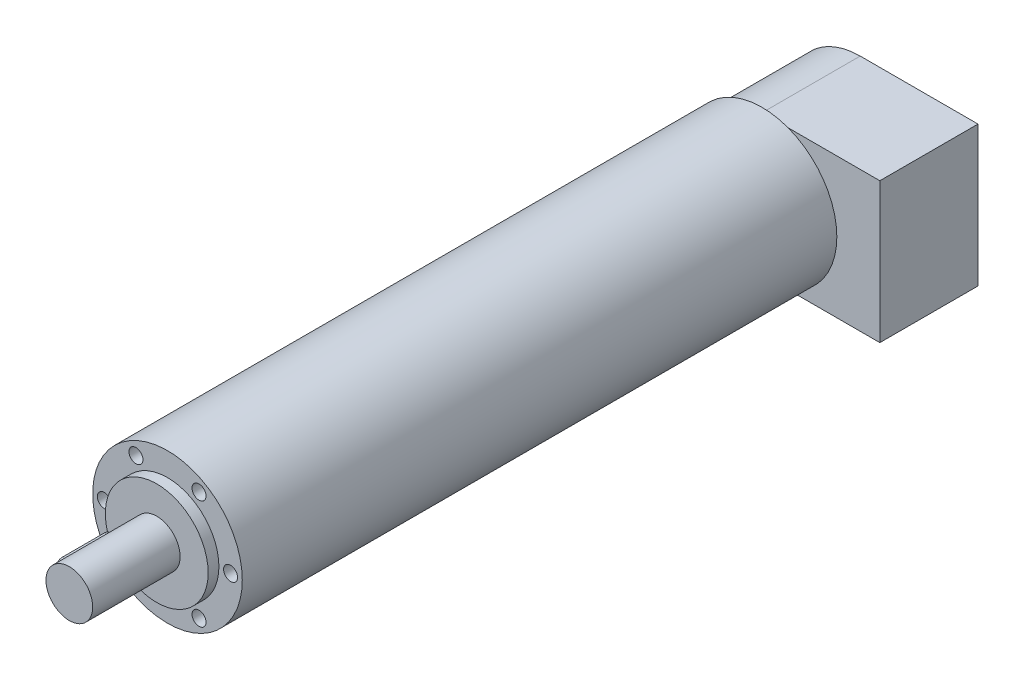
ISO-10303-21;
HEADER;
FILE_DESCRIPTION(('STEP AP214'),'2;1');
FILE_NAME('part.step','',(''),(''),'','','');
FILE_SCHEMA(('AUTOMOTIVE_DESIGN { 1 0 10303 214 1 1 1 1 }'));
ENDSEC;
DATA;
#1=APPLICATION_CONTEXT('core data for automotive mechanical design processes');
#2=APPLICATION_PROTOCOL_DEFINITION('international standard','automotive_design',2000,#1);
#3=PRODUCT_CONTEXT('',#1,'mechanical');
#4=PRODUCT('Part','Part','',(#3));
#5=PRODUCT_RELATED_PRODUCT_CATEGORY('part','',(#4));
#6=PRODUCT_DEFINITION_FORMATION('','',#4);
#7=PRODUCT_DEFINITION_CONTEXT('part definition',#1,'design');
#8=PRODUCT_DEFINITION('design','',#6,#7);
#9=PRODUCT_DEFINITION_SHAPE('','',#8);
#10=(LENGTH_UNIT() NAMED_UNIT(*) SI_UNIT(.MILLI.,.METRE.));
#11=(NAMED_UNIT(*) PLANE_ANGLE_UNIT() SI_UNIT($,.RADIAN.));
#12=(NAMED_UNIT(*) SI_UNIT($,.STERADIAN.) SOLID_ANGLE_UNIT());
#13=UNCERTAINTY_MEASURE_WITH_UNIT(LENGTH_MEASURE(1.E-05),#10,'distance_accuracy_value','');
#14=(GEOMETRIC_REPRESENTATION_CONTEXT(3) GLOBAL_UNCERTAINTY_ASSIGNED_CONTEXT((#13)) GLOBAL_UNIT_ASSIGNED_CONTEXT((#10,
#11,#12)) REPRESENTATION_CONTEXT('',''));
#15=CARTESIAN_POINT('',(0.,0.,0.));
#16=DIRECTION('',(0.,0.,1.));
#17=DIRECTION('',(1.,0.,0.));
#18=AXIS2_PLACEMENT_3D('',#15,#16,#17);
#19=CARTESIAN_POINT('',(0.,0.,21.));
#20=DIRECTION('',(0.,0.,-1.));
#21=DIRECTION('',(-1.,0.,0.));
#22=AXIS2_PLACEMENT_3D('',#19,#20,#21);
#23=CYLINDRICAL_SURFACE('',#22,15.);
#24=CARTESIAN_POINT('',(0.,0.,21.));
#25=DIRECTION('',(0.,0.,1.));
#26=DIRECTION('',(1.,0.,0.));
#27=AXIS2_PLACEMENT_3D('',#24,#25,#26);
#28=CIRCLE('',#27,15.);
#29=CARTESIAN_POINT('',(0.,15.,21.));
#30=VERTEX_POINT('',#29);
#31=CARTESIAN_POINT('',(0.,-15.,21.));
#32=VERTEX_POINT('',#31);
#33=EDGE_CURVE('E188',#30,#32,#28,.T.);
#34=ORIENTED_EDGE('',*,*,#33,.F.);
#35=DIRECTION('',(0.,0.,1.));
#36=VECTOR('',#35,1.);
#37=CARTESIAN_POINT('',(0.,15.,21.));
#38=LINE('',#37,#36);
#39=CARTESIAN_POINT('',(0.,15.,0.));
#40=VERTEX_POINT('',#39);
#41=EDGE_CURVE('E161',#40,#30,#38,.T.);
#42=ORIENTED_EDGE('',*,*,#41,.F.);
#43=CARTESIAN_POINT('',(0.,0.,0.));
#44=DIRECTION('',(0.,0.,1.));
#45=DIRECTION('',(1.,0.,0.));
#46=AXIS2_PLACEMENT_3D('',#43,#44,#45);
#47=CIRCLE('',#46,15.);
#48=CARTESIAN_POINT('',(0.,-15.,0.));
#49=VERTEX_POINT('',#48);
#50=EDGE_CURVE('E187',#40,#49,#47,.T.);
#51=ORIENTED_EDGE('',*,*,#50,.T.);
#52=DIRECTION('',(0.,0.,-1.));
#53=VECTOR('',#52,1.);
#54=CARTESIAN_POINT('',(0.,-15.,21.));
#55=LINE('',#54,#53);
#56=EDGE_CURVE('E168',#32,#49,#55,.T.);
#57=ORIENTED_EDGE('',*,*,#56,.F.);
#58=EDGE_LOOP('',(#34,#42,#51,#57));
#59=FACE_BOUND('',#58,.T.);
#60=ADVANCED_FACE('F34',(#59),#23,.T.);
#61=CARTESIAN_POINT('',(0.,0.,21.));
#62=DIRECTION('',(0.,0.,1.));
#63=DIRECTION('',(1.,0.,0.));
#64=AXIS2_PLACEMENT_3D('',#61,#62,#63);
#65=PLANE('',#64);
#66=CARTESIAN_POINT('',(0.,0.,21.));
#67=DIRECTION('',(0.,0.,1.));
#68=DIRECTION('',(1.,0.,0.));
#69=AXIS2_PLACEMENT_3D('',#66,#67,#68);
#70=CIRCLE('',#69,16.);
#71=CARTESIAN_POINT('',(5.56776436283001,-15.,21.));
#72=VERTEX_POINT('',#71);
#73=CARTESIAN_POINT('',(5.56776436283003,15.,21.));
#74=VERTEX_POINT('',#73);
#75=EDGE_CURVE('E61',#72,#74,#70,.T.);
#76=ORIENTED_EDGE('',*,*,#75,.F.);
#77=DIRECTION('',(-1.,0.,0.));
#78=VECTOR('',#77,1.);
#79=CARTESIAN_POINT('',(25.2,-15.,21.));
#80=LINE('',#79,#78);
#81=CARTESIAN_POINT('',(25.2,-15.,21.));
#82=VERTEX_POINT('',#81);
#83=EDGE_CURVE('E180',#82,#72,#80,.T.);
#84=ORIENTED_EDGE('',*,*,#83,.F.);
#85=DIRECTION('',(0.,-1.,0.));
#86=VECTOR('',#85,1.);
#87=CARTESIAN_POINT('',(25.2,-15.,21.));
#88=LINE('',#87,#86);
#89=CARTESIAN_POINT('',(25.2,15.,21.));
#90=VERTEX_POINT('',#89);
#91=EDGE_CURVE('E170',#90,#82,#88,.T.);
#92=ORIENTED_EDGE('',*,*,#91,.F.);
#93=DIRECTION('',(-1.,0.,0.));
#94=VECTOR('',#93,1.);
#95=CARTESIAN_POINT('',(25.2,15.,21.));
#96=LINE('',#95,#94);
#97=EDGE_CURVE('E183',#90,#74,#96,.T.);
#98=ORIENTED_EDGE('',*,*,#97,.T.);
#99=EDGE_LOOP('',(#76,#84,#92,#98));
#100=FACE_BOUND('',#99,.T.);
#101=ADVANCED_FACE('F223',(#100),#65,.T.);
#102=CARTESIAN_POINT('',(0.,0.,0.));
#103=DIRECTION('',(0.,0.,1.));
#104=DIRECTION('',(1.,0.,0.));
#105=AXIS2_PLACEMENT_3D('',#102,#103,#104);
#106=PLANE('',#105);
#107=ORIENTED_EDGE('',*,*,#50,.F.);
#108=DIRECTION('',(-1.,0.,0.));
#109=VECTOR('',#108,1.);
#110=CARTESIAN_POINT('',(25.2,15.,0.));
#111=LINE('',#110,#109);
#112=CARTESIAN_POINT('',(25.2,15.,0.));
#113=VERTEX_POINT('',#112);
#114=EDGE_CURVE('E185',#113,#40,#111,.T.);
#115=ORIENTED_EDGE('',*,*,#114,.F.);
#116=DIRECTION('',(0.,1.,0.));
#117=VECTOR('',#116,1.);
#118=CARTESIAN_POINT('',(25.2,-15.,0.));
#119=LINE('',#118,#117);
#120=CARTESIAN_POINT('',(25.2,-15.,0.));
#121=VERTEX_POINT('',#120);
#122=EDGE_CURVE('E164',#121,#113,#119,.T.);
#123=ORIENTED_EDGE('',*,*,#122,.F.);
#124=DIRECTION('',(-1.,0.,0.));
#125=VECTOR('',#124,1.);
#126=CARTESIAN_POINT('',(25.2,-15.,0.));
#127=LINE('',#126,#125);
#128=EDGE_CURVE('E174',#121,#49,#127,.T.);
#129=ORIENTED_EDGE('',*,*,#128,.T.);
#130=EDGE_LOOP('',(#107,#115,#123,#129));
#131=FACE_BOUND('',#130,.T.);
#132=ADVANCED_FACE('F228',(#131),#106,.F.);
#133=CARTESIAN_POINT('',(25.2,15.,21.));
#134=DIRECTION('',(0.,-1.,0.));
#135=DIRECTION('',(0.,0.,-1.));
#136=AXIS2_PLACEMENT_3D('',#133,#134,#135);
#137=PLANE('',#136);
#138=ORIENTED_EDGE('',*,*,#41,.T.);
#139=EDGE_CURVE('E182',#74,#30,#96,.T.);
#140=ORIENTED_EDGE('',*,*,#139,.F.);
#141=ORIENTED_EDGE('',*,*,#97,.F.);
#142=DIRECTION('',(0.,0.,1.));
#143=VECTOR('',#142,1.);
#144=CARTESIAN_POINT('',(25.2,15.,21.));
#145=LINE('',#144,#143);
#146=EDGE_CURVE('E167',#113,#90,#145,.T.);
#147=ORIENTED_EDGE('',*,*,#146,.F.);
#148=ORIENTED_EDGE('',*,*,#114,.T.);
#149=EDGE_LOOP('',(#138,#140,#141,#147,#148));
#150=FACE_BOUND('',#149,.T.);
#151=ADVANCED_FACE('F242',(#150),#137,.F.);
#152=CARTESIAN_POINT('',(25.2,-15.,21.));
#153=DIRECTION('',(0.,1.,0.));
#154=DIRECTION('',(0.,0.,1.));
#155=AXIS2_PLACEMENT_3D('',#152,#153,#154);
#156=PLANE('',#155);
#157=ORIENTED_EDGE('',*,*,#56,.T.);
#158=ORIENTED_EDGE('',*,*,#128,.F.);
#159=DIRECTION('',(0.,0.,-1.));
#160=VECTOR('',#159,1.);
#161=CARTESIAN_POINT('',(25.2,-15.,21.));
#162=LINE('',#161,#160);
#163=EDGE_CURVE('E172',#82,#121,#162,.T.);
#164=ORIENTED_EDGE('',*,*,#163,.F.);
#165=ORIENTED_EDGE('',*,*,#83,.T.);
#166=EDGE_CURVE('E179',#72,#32,#80,.T.);
#167=ORIENTED_EDGE('',*,*,#166,.T.);
#168=EDGE_LOOP('',(#157,#158,#164,#165,#167));
#169=FACE_BOUND('',#168,.T.);
#170=ADVANCED_FACE('F257',(#169),#156,.F.);
#171=CARTESIAN_POINT('',(25.2,0.,0.));
#172=DIRECTION('',(-1.,0.,0.));
#173=DIRECTION('',(0.,0.,1.));
#174=AXIS2_PLACEMENT_3D('',#171,#172,#173);
#175=PLANE('',#174);
#176=ORIENTED_EDGE('',*,*,#122,.T.);
#177=ORIENTED_EDGE('',*,*,#146,.T.);
#178=ORIENTED_EDGE('',*,*,#91,.T.);
#179=ORIENTED_EDGE('',*,*,#163,.T.);
#180=EDGE_LOOP('',(#176,#177,#178,#179));
#181=FACE_BOUND('',#180,.T.);
#182=ADVANCED_FACE('F248',(#181),#175,.F.);
#183=CARTESIAN_POINT('',(0.,0.,148.2));
#184=DIRECTION('',(0.,0.,-1.));
#185=DIRECTION('',(-1.,0.,0.));
#186=AXIS2_PLACEMENT_3D('',#183,#184,#185);
#187=CYLINDRICAL_SURFACE('',#186,16.);
#188=CARTESIAN_POINT('',(0.,0.,148.2));
#189=DIRECTION('',(0.,0.,1.));
#190=DIRECTION('',(1.,0.,0.));
#191=AXIS2_PLACEMENT_3D('',#188,#189,#190);
#192=CIRCLE('',#191,16.);
#193=CARTESIAN_POINT('',(16.,0.,148.2));
#194=VERTEX_POINT('',#193);
#195=EDGE_CURVE('E158',#194,#194,#192,.T.);
#196=ORIENTED_EDGE('',*,*,#195,.F.);
#197=EDGE_LOOP('',(#196));
#198=FACE_BOUND('',#197,.T.);
#199=EDGE_CURVE('E155',#74,#72,#70,.T.);
#200=ORIENTED_EDGE('',*,*,#199,.T.);
#201=ORIENTED_EDGE('',*,*,#75,.T.);
#202=EDGE_LOOP('',(#200,#201));
#203=FACE_BOUND('',#202,.T.);
#204=ADVANCED_FACE('F245',(#198,#203),#187,.T.);
#205=CARTESIAN_POINT('',(0.,0.,148.2));
#206=DIRECTION('',(0.,0.,1.));
#207=DIRECTION('',(1.,0.,0.));
#208=AXIS2_PLACEMENT_3D('',#205,#206,#207);
#209=PLANE('',#208);
#210=CARTESIAN_POINT('',(6.75000000000014,11.6913429510898,148.2));
#211=DIRECTION('',(0.,0.,1.));
#212=DIRECTION('',(0.50000000000001,0.866025403784433,0.));
#213=AXIS2_PLACEMENT_3D('',#210,#211,#212);
#214=CIRCLE('',#213,1.5);
#215=CARTESIAN_POINT('',(7.50000000000015,12.9903810567665,148.2));
#216=VERTEX_POINT('',#215);
#217=EDGE_CURVE('E510',#216,#216,#214,.T.);
#218=ORIENTED_EDGE('',*,*,#217,.F.);
#219=EDGE_LOOP('',(#218));
#220=FACE_BOUND('',#219,.T.);
#221=CARTESIAN_POINT('',(-6.74999999999989,11.69134295109,148.2));
#222=DIRECTION('',(0.,0.,1.));
#223=DIRECTION('',(-0.499999999999992,0.866025403784443,0.));
#224=AXIS2_PLACEMENT_3D('',#221,#222,#223);
#225=CIRCLE('',#224,1.5);
#226=CARTESIAN_POINT('',(-7.49999999999988,12.9903810567666,148.2));
#227=VERTEX_POINT('',#226);
#228=EDGE_CURVE('E509',#227,#227,#225,.T.);
#229=ORIENTED_EDGE('',*,*,#228,.F.);
#230=EDGE_LOOP('',(#229));
#231=FACE_BOUND('',#230,.T.);
#232=CARTESIAN_POINT('',(-13.5,0.,148.2));
#233=DIRECTION('',(0.,0.,1.));
#234=DIRECTION('',(-1.,0.,0.));
#235=AXIS2_PLACEMENT_3D('',#232,#233,#234);
#236=CIRCLE('',#235,1.5);
#237=CARTESIAN_POINT('',(-15.,0.,148.2));
#238=VERTEX_POINT('',#237);
#239=EDGE_CURVE('E537',#238,#238,#236,.T.);
#240=ORIENTED_EDGE('',*,*,#239,.F.);
#241=EDGE_LOOP('',(#240));
#242=FACE_BOUND('',#241,.T.);
#243=CARTESIAN_POINT('',(-6.75000000000006,-11.6913429510899,148.2));
#244=DIRECTION('',(0.,0.,1.));
#245=DIRECTION('',(-0.500000000000004,-0.866025403784436,0.));
#246=AXIS2_PLACEMENT_3D('',#243,#244,#245);
#247=CIRCLE('',#246,1.5);
#248=CARTESIAN_POINT('',(-7.50000000000006,-12.9903810567665,148.2));
#249=VERTEX_POINT('',#248);
#250=EDGE_CURVE('E528',#249,#249,#247,.T.);
#251=ORIENTED_EDGE('',*,*,#250,.F.);
#252=EDGE_LOOP('',(#251));
#253=FACE_BOUND('',#252,.T.);
#254=CARTESIAN_POINT('',(6.74999999999997,-11.6913429510899,148.2));
#255=DIRECTION('',(0.,0.,1.));
#256=DIRECTION('',(0.499999999999998,-0.86602540378444,0.));
#257=AXIS2_PLACEMENT_3D('',#254,#255,#256);
#258=CIRCLE('',#257,1.5);
#259=CARTESIAN_POINT('',(7.49999999999997,-12.9903810567666,148.2));
#260=VERTEX_POINT('',#259);
#261=EDGE_CURVE('E522',#260,#260,#258,.T.);
#262=ORIENTED_EDGE('',*,*,#261,.F.);
#263=EDGE_LOOP('',(#262));
#264=FACE_BOUND('',#263,.T.);
#265=CARTESIAN_POINT('',(13.5,0.,148.2));
#266=DIRECTION('',(0.,0.,1.));
#267=DIRECTION('',(1.,0.,0.));
#268=AXIS2_PLACEMENT_3D('',#265,#266,#267);
#269=CIRCLE('',#268,1.5);
#270=CARTESIAN_POINT('',(15.,0.,148.2));
#271=VERTEX_POINT('',#270);
#272=EDGE_CURVE('E134',#271,#271,#269,.T.);
#273=ORIENTED_EDGE('',*,*,#272,.F.);
#274=EDGE_LOOP('',(#273));
#275=FACE_BOUND('',#274,.T.);
#276=CARTESIAN_POINT('',(0.,0.,148.2));
#277=DIRECTION('',(0.,0.,1.));
#278=DIRECTION('',(1.,0.,0.));
#279=AXIS2_PLACEMENT_3D('',#276,#277,#278);
#280=CIRCLE('',#279,11.);
#281=CARTESIAN_POINT('',(11.,0.,148.2));
#282=VERTEX_POINT('',#281);
#283=EDGE_CURVE('E152',#282,#282,#280,.T.);
#284=ORIENTED_EDGE('',*,*,#283,.F.);
#285=EDGE_LOOP('',(#284));
#286=FACE_BOUND('',#285,.T.);
#287=ORIENTED_EDGE('',*,*,#195,.T.);
#288=EDGE_LOOP('',(#287));
#289=FACE_BOUND('',#288,.T.);
#290=ADVANCED_FACE('F247',(#220,#231,#242,#253,#264,#275,#286,#289),#209,.T.);
#291=CARTESIAN_POINT('',(0.,0.,21.));
#292=DIRECTION('',(0.,0.,1.));
#293=DIRECTION('',(1.,0.,0.));
#294=AXIS2_PLACEMENT_3D('',#291,#292,#293);
#295=PLANE('',#294);
#296=ORIENTED_EDGE('',*,*,#166,.F.);
#297=ORIENTED_EDGE('',*,*,#199,.F.);
#298=ORIENTED_EDGE('',*,*,#139,.T.);
#299=ORIENTED_EDGE('',*,*,#33,.T.);
#300=EDGE_LOOP('',(#296,#297,#298,#299));
#301=FACE_BOUND('',#300,.T.);
#302=ADVANCED_FACE('F239',(#301),#295,.F.);
#303=CARTESIAN_POINT('',(0.,0.,150.5));
#304=DIRECTION('',(0.,0.,-1.));
#305=DIRECTION('',(-1.,0.,0.));
#306=AXIS2_PLACEMENT_3D('',#303,#304,#305);
#307=CYLINDRICAL_SURFACE('',#306,11.);
#308=CARTESIAN_POINT('',(0.,0.,150.5));
#309=DIRECTION('',(0.,0.,1.));
#310=DIRECTION('',(1.,0.,0.));
#311=AXIS2_PLACEMENT_3D('',#308,#309,#310);
#312=CIRCLE('',#311,11.);
#313=CARTESIAN_POINT('',(11.,0.,150.5));
#314=VERTEX_POINT('',#313);
#315=EDGE_CURVE('E148',#314,#314,#312,.T.);
#316=ORIENTED_EDGE('',*,*,#315,.F.);
#317=EDGE_LOOP('',(#316));
#318=FACE_BOUND('',#317,.T.);
#319=ORIENTED_EDGE('',*,*,#283,.T.);
#320=EDGE_LOOP('',(#319));
#321=FACE_BOUND('',#320,.T.);
#322=ADVANCED_FACE('F330',(#318,#321),#307,.T.);
#323=CARTESIAN_POINT('',(0.,0.,150.5));
#324=DIRECTION('',(0.,0.,1.));
#325=DIRECTION('',(1.,0.,0.));
#326=AXIS2_PLACEMENT_3D('',#323,#324,#325);
#327=PLANE('',#326);
#328=CARTESIAN_POINT('',(0.,0.,150.5));
#329=DIRECTION('',(0.,0.,1.));
#330=DIRECTION('',(1.,0.,0.));
#331=AXIS2_PLACEMENT_3D('',#328,#329,#330);
#332=CIRCLE('',#331,5.);
#333=CARTESIAN_POINT('',(5.,0.,150.5));
#334=VERTEX_POINT('',#333);
#335=EDGE_CURVE('E149',#334,#334,#332,.T.);
#336=ORIENTED_EDGE('',*,*,#335,.F.);
#337=EDGE_LOOP('',(#336));
#338=FACE_BOUND('',#337,.T.);
#339=ORIENTED_EDGE('',*,*,#315,.T.);
#340=EDGE_LOOP('',(#339));
#341=FACE_BOUND('',#340,.T.);
#342=ADVANCED_FACE('F220',(#338,#341),#327,.T.);
#343=CARTESIAN_POINT('',(0.,0.,169.2));
#344=DIRECTION('',(0.,0.,-1.));
#345=DIRECTION('',(-1.,0.,0.));
#346=AXIS2_PLACEMENT_3D('',#343,#344,#345);
#347=CYLINDRICAL_SURFACE('',#346,5.);
#348=DIRECTION('',(0.,0.,-1.));
#349=VECTOR('',#348,1.);
#350=CARTESIAN_POINT('',(-4.76969600708475,-1.49999999999993,169.2));
#351=LINE('',#350,#349);
#352=CARTESIAN_POINT('',(-4.76969600708475,-1.49999999999993,164.7));
#353=VERTEX_POINT('',#352);
#354=CARTESIAN_POINT('',(-4.76969600708475,-1.49999999999993,155.7));
#355=VERTEX_POINT('',#354);
#356=EDGE_CURVE('E46',#353,#355,#351,.T.);
#357=ORIENTED_EDGE('',*,*,#356,.T.);
#358=CARTESIAN_POINT('',(-4.76969600708475,-1.49999999999993,155.7));
#359=CARTESIAN_POINT('',(-4.76969249084936,-1.50000085357064,155.658820607092));
#360=CARTESIAN_POINT('',(-4.77022997000131,-1.49830317083421,155.617661956874));
#361=CARTESIAN_POINT('',(-4.77235095110001,-1.4915378566031,155.535658837904));
#362=CARTESIAN_POINT('',(-4.77393421787378,-1.48647098275834,155.494814300605));
#363=CARTESIAN_POINT('',(-4.78018490618875,-1.46630203689304,155.373409459045));
#364=CARTESIAN_POINT('',(-4.78635370384277,-1.44623120413656,155.293693609584));
#365=CARTESIAN_POINT('',(-4.8019595211321,-1.3935310231562,155.138964421614));
#366=CARTESIAN_POINT('',(-4.81139539670395,-1.36090607068197,155.063949447802));
#367=CARTESIAN_POINT('',(-4.83246571212053,-1.28407841117649,154.920403318402));
#368=CARTESIAN_POINT('',(-4.84410117434935,-1.23987031651219,154.851875200272));
#369=CARTESIAN_POINT('',(-4.86866835244723,-1.13964850658318,154.721133944003));
#370=CARTESIAN_POINT('',(-4.88162755412976,-1.08333433465201,154.659156339657));
#371=CARTESIAN_POINT('',(-4.90714811559051,-0.961138919873285,154.5453644161));
#372=CARTESIAN_POINT('',(-4.9197094078525,-0.895256063916285,154.493551813997));
#373=CARTESIAN_POINT('',(-4.94333239727706,-0.754109921315373,154.400536229681));
#374=CARTESIAN_POINT('',(-4.95435770971355,-0.678680819336201,154.359574819702));
#375=CARTESIAN_POINT('',(-4.97334469846208,-0.521621185505713,154.291011588382));
#376=CARTESIAN_POINT('',(-4.98130716463903,-0.439992259012864,154.263406322206));
#377=CARTESIAN_POINT('',(-4.99307639935002,-0.275324697874812,154.223120200898));
#378=CARTESIAN_POINT('',(-4.99699549276993,-0.192393125294188,154.21003514203));
#379=CARTESIAN_POINT('',(-5.00063202022426,-0.0254235719980145,154.197882658637));
#380=CARTESIAN_POINT('',(-5.00035024971471,0.0586141962424306,154.1988125803));
#381=CARTESIAN_POINT('',(-4.99569602566266,0.222571599946088,154.214392908759));
#382=CARTESIAN_POINT('',(-4.99145415509187,0.302537145464714,154.228605344979));
#383=CARTESIAN_POINT('',(-4.97951513699979,0.458890052102094,154.269631635238));
#384=CARTESIAN_POINT('',(-4.97181780846028,0.535277225532061,154.296446149456));
#385=CARTESIAN_POINT('',(-4.95365214926144,0.683347815892281,154.362212221646));
#386=CARTESIAN_POINT('',(-4.94315255692524,0.754966006044213,154.401301644357));
#387=CARTESIAN_POINT('',(-4.92049624651754,0.890765529574494,154.490398590048));
#388=CARTESIAN_POINT('',(-4.90833915735883,0.954945191614665,154.540408559479));
#389=CARTESIAN_POINT('',(-4.88311673571408,1.07665450541281,154.652191988084));
#390=CARTESIAN_POINT('',(-4.87003445449552,1.1338335147804,154.714343863761));
#391=CARTESIAN_POINT('',(-4.84484215114657,1.23706769492494,154.847497423428));
#392=CARTESIAN_POINT('',(-4.83273241337563,1.28311962013085,154.918501680365));
#393=CARTESIAN_POINT('',(-4.81077228795651,1.36316407240871,155.068280928449));
#394=CARTESIAN_POINT('',(-4.80094596245946,1.39703006341142,155.147127179593));
#395=CARTESIAN_POINT('',(-4.78495663653199,1.45085886004706,155.309724503982));
#396=CARTESIAN_POINT('',(-4.77878803475873,1.47084293218042,155.393467860714));
#397=CARTESIAN_POINT('',(-4.77314032325004,1.48901203590086,155.51499488907));
#398=CARTESIAN_POINT('',(-4.77185156275265,1.49313202989016,155.55189073418));
#399=CARTESIAN_POINT('',(-4.7701292861178,1.49862355614861,155.625851479099));
#400=CARTESIAN_POINT('',(-4.76969451246642,1.49999912968276,155.662916049664));
#401=CARTESIAN_POINT('',(-4.76969600708471,1.50000000000007,155.7));
#402=B_SPLINE_CURVE_WITH_KNOTS('',3,(#358,#359,#360,#361,#362,#363,#364,#365,#366,#367,#368,
#369,#370,#371,#372,#373,#374,#375,#376,#377,#378,#379,#380,#381,#382,#383,#384,#385,#386,#387,
#388,#389,#390,#391,#392,#393,#394,#395,#396,#397,#398,#399,#400,#401),.UNSPECIFIED.,.F.,.F.,(4,
2,2,2,2,2,2,2,2,2,2,2,2,2,2,2,2,2,2,2,2,4),(0.,0.123459071219709,0.24689038885304,
0.492911349615204,0.738846245884286,0.984895736828092,1.23795510798804,1.49105719006935,
1.74939356197454,2.00766326783255,2.25854751319801,2.5093842528947,2.75223130012967,
2.99509107067835,3.2407824256273,3.48652887757005,3.7417256831098,3.99699683536776,
4.25484698071528,4.51230123440206,4.62365084745808,4.73483637253615),.UNSPECIFIED.);
#403=CARTESIAN_POINT('',(-4.76969600708471,1.50000000000007,155.7));
#404=VERTEX_POINT('',#403);
#405=EDGE_CURVE('E11',#355,#404,#402,.T.);
#406=ORIENTED_EDGE('',*,*,#405,.T.);
#407=DIRECTION('',(0.,0.,-1.));
#408=VECTOR('',#407,1.);
#409=CARTESIAN_POINT('',(-4.76969600708471,1.50000000000007,169.2));
#410=LINE('',#409,#408);
#411=CARTESIAN_POINT('',(-4.76969600708471,1.50000000000007,164.7));
#412=VERTEX_POINT('',#411);
#413=EDGE_CURVE('E113',#404,#412,#410,.F.);
#414=ORIENTED_EDGE('',*,*,#413,.T.);
#415=CARTESIAN_POINT('',(-5.,0.,166.2));
#416=CARTESIAN_POINT('',(-4.9999992925055,-0.082288612753302,166.199999002515));
#417=CARTESIAN_POINT('',(-4.99794915693954,-0.164587318351533,166.193206136376));
#418=CARTESIAN_POINT('',(-4.98997105593691,-0.326788125304882,166.166278645778));
#419=CARTESIAN_POINT('',(-4.98404193389692,-0.406689504411416,166.146140041977));
#420=CARTESIAN_POINT('',(-4.96895552501836,-0.561732707754522,166.09325398309));
#421=CARTESIAN_POINT('',(-4.95980300250425,-0.636881364395372,166.060525130381));
#422=CARTESIAN_POINT('',(-4.93922109237645,-0.780624181053131,165.983463906944));
#423=CARTESIAN_POINT('',(-4.92779140192067,-0.849217467469666,165.939129992605));
#424=CARTESIAN_POINT('',(-4.90350737192774,-0.979871797183737,165.838775992527));
#425=CARTESIAN_POINT('',(-4.89062383657036,-1.04171807124433,165.782483374114));
#426=CARTESIAN_POINT('',(-4.86505834210443,-1.15524920923322,165.66039077009));
#427=CARTESIAN_POINT('',(-4.85237641724502,-1.20693236327439,165.594589187875));
#428=CARTESIAN_POINT('',(-4.82834113993773,-1.29980037723704,165.453529246962));
#429=CARTESIAN_POINT('',(-4.81702406663876,-1.34072309022209,165.378091539009));
#430=CARTESIAN_POINT('',(-4.79743620394033,-1.40921394774755,165.22101074577));
#431=CARTESIAN_POINT('',(-4.78916468313312,-1.43678529919968,165.139369156072));
#432=CARTESIAN_POINT('',(-4.77690870838436,-1.47701633682645,164.974609733869));
#433=CARTESIAN_POINT('',(-4.77281069324536,-1.49007196234671,164.891597256136));
#434=CARTESIAN_POINT('',(-4.76902789749769,-1.50213730614665,164.724466843783));
#435=CARTESIAN_POINT('',(-4.76934204760573,-1.50115042761071,164.640349181941));
#436=CARTESIAN_POINT('',(-4.7742474406778,-1.48546977199804,164.476616091391));
#437=CARTESIAN_POINT('',(-4.77868388599143,-1.47127205262677,164.396947749638));
#438=CARTESIAN_POINT('',(-4.79108356228627,-1.43037420427048,164.241180213726));
#439=CARTESIAN_POINT('',(-4.79904714132353,-1.40367284141632,164.165081372626));
#440=CARTESIAN_POINT('',(-4.81772733074976,-1.33816026653672,164.017399650339));
#441=CARTESIAN_POINT('',(-4.82848016115955,-1.29918816934633,163.945892916045));
#442=CARTESIAN_POINT('',(-4.85150987000067,-1.21035222588673,163.81026797799));
#443=CARTESIAN_POINT('',(-4.86378711746994,-1.16048574002578,163.746151570586));
#444=CARTESIAN_POINT('',(-4.8891101129794,-1.04881290765534,163.624313809238));
#445=CARTESIAN_POINT('',(-4.902166543105,-0.986594907466844,163.56697133597));
#446=CARTESIAN_POINT('',(-4.92712244063261,-0.853263259313824,163.463446015936));
#447=CARTESIAN_POINT('',(-4.93902183518412,-0.78214905186074,163.417263871586));
#448=CARTESIAN_POINT('',(-4.96043160069472,-0.632355038342649,163.337140077535));
#449=CARTESIAN_POINT('',(-4.96992543668316,-0.553627749747796,163.30328248375));
#450=CARTESIAN_POINT('',(-4.98533521832223,-0.391245415603362,163.2494004099));
#451=CARTESIAN_POINT('',(-4.99125216187,-0.307591751589422,163.229372071467));
#452=CARTESIAN_POINT('',(-4.99868364643539,-0.140952242668174,163.204347822101));
#453=CARTESIAN_POINT('',(-5.0003485041779,-0.0580500976010336,163.198838414198));
#454=CARTESIAN_POINT('',(-4.99952923241759,0.10749960582353,163.201569155712));
#455=CARTESIAN_POINT('',(-4.99704565677756,0.190147196690926,163.209807469651));
#456=CARTESIAN_POINT('',(-4.98830696987162,0.350903605309834,163.239384611112));
#457=CARTESIAN_POINT('',(-4.98213829799416,0.429072772614299,163.260423387581));
#458=CARTESIAN_POINT('',(-4.96674347841531,0.58075463895465,163.314643232778));
#459=CARTESIAN_POINT('',(-4.95751696321083,0.654266777025717,163.347825761038));
#460=CARTESIAN_POINT('',(-4.93669654351323,0.796437189461179,163.426253165481));
#461=CARTESIAN_POINT('',(-4.92505280829673,0.864943826199786,163.471759340948));
#462=CARTESIAN_POINT('',(-4.90073468764315,0.993523307980255,163.573224754053));
#463=CARTESIAN_POINT('',(-4.88806004431077,1.05359403235604,163.629186611888));
#464=CARTESIAN_POINT('',(-4.86253171869135,1.16585744551038,163.752387308369));
#465=CARTESIAN_POINT('',(-4.84968825033265,1.21768481231515,163.819961875772));
#466=CARTESIAN_POINT('',(-4.82576515238461,1.30928995072164,163.963127939014));
#467=CARTESIAN_POINT('',(-4.81468547654648,1.34906803829482,164.038719224558));
#468=CARTESIAN_POINT('',(-4.79567189615052,1.41517347127178,164.195532491255));
#469=CARTESIAN_POINT('',(-4.78772337843824,1.44156346937059,164.276726186537));
#470=CARTESIAN_POINT('',(-4.77591594362792,1.48021730815123,164.442687968932));
#471=CARTESIAN_POINT('',(-4.77205562508298,1.49248598978787,164.527454820788));
#472=CARTESIAN_POINT('',(-4.76899972496085,1.50221984485066,164.694361518376));
#473=CARTESIAN_POINT('',(-4.76961647442752,1.50028055308497,164.776463651018));
#474=CARTESIAN_POINT('',(-4.77499401288293,1.48307505444819,164.939114103373));
#475=CARTESIAN_POINT('',(-4.7797546359255,1.46780938124721,165.019662485176));
#476=CARTESIAN_POINT('',(-4.79275763670385,1.4247688880414,165.175945399143));
#477=CARTESIAN_POINT('',(-4.80095604545964,1.39715175507072,165.251727287362));
#478=CARTESIAN_POINT('',(-4.81990278909135,1.33031507121132,165.397642438818));
#479=CARTESIAN_POINT('',(-4.83065161194311,1.29109329962879,165.467774617641));
#480=CARTESIAN_POINT('',(-4.85397676425832,1.20048763805073,165.603163116527));
#481=CARTESIAN_POINT('',(-4.86660540163797,1.14871276092995,165.66814876126));
#482=CARTESIAN_POINT('',(-4.89201320450026,1.03517434629782,165.788702498308));
#483=CARTESIAN_POINT('',(-4.90479240823905,0.973408217134499,165.844268139468));
#484=CARTESIAN_POINT('',(-4.92950936570649,0.839465762183244,165.946023412295));
#485=CARTESIAN_POINT('',(-4.94141159765674,0.767037885790607,165.991891446856));
#486=CARTESIAN_POINT('',(-4.96260680455813,0.615141373983532,166.070735169904));
#487=CARTESIAN_POINT('',(-4.97190099931066,0.535676052998958,166.103716888275));
#488=CARTESIAN_POINT('',(-4.98602174969301,0.380757712655287,166.152895275653));
#489=CARTESIAN_POINT('',(-4.99122027381068,0.305786961954241,166.170511672883));
#490=CARTESIAN_POINT('',(-4.99820944494492,0.153880195230785,166.194063525242));
#491=CARTESIAN_POINT('',(-5.0000006615474,0.0769445098581422,166.200000932705));
#492=CARTESIAN_POINT('',(-5.,0.,166.2));
#493=B_SPLINE_CURVE_WITH_KNOTS('',3,(#415,#416,#417,#418,#419,#420,#421,#422,#423,#424,#425,
#426,#427,#428,#429,#430,#431,#432,#433,#434,#435,#436,#437,#438,#439,#440,#441,#442,#443,#444,
#445,#446,#447,#448,#449,#450,#451,#452,#453,#454,#455,#456,#457,#458,#459,#460,#461,#462,#463,
#464,#465,#466,#467,#468,#469,#470,#471,#472,#473,#474,#475,#476,#477,#478,#479,#480,#481,#482,
#483,#484,#485,#486,#487,#488,#489,#490,#491,#492),.UNSPECIFIED.,.T.,.F.,(4,2,2,2,2,2,2,2,2,2,2,
2,2,2,2,2,2,2,2,2,2,2,2,2,2,2,2,2,2,2,2,2,2,2,2,2,2,2,4),(0.,0.246583203612614,
0.493239964846004,0.739533676300879,0.985860164412707,1.23855602948194,1.49129437288634,
1.74971481004106,2.00807314543223,2.25919689356595,2.51025978319087,2.75226016697671,
2.99428443657999,3.23962426447116,3.48502360158554,3.74067104048167,3.99633456531073,
4.2537104688169,4.51101453528809,4.75908809438545,5.00712853550326,5.24956746682326,
5.49203554593727,5.74011305702906,5.98825282000189,6.24540400322817,6.50254844252682,
6.75847814951253,7.01432009460284,7.25950155466946,7.50467319661603,7.74680040402723,
7.98897397553108,8.23996925679932,8.49102974897504,8.74942996156672,9.00770911595234,
9.23831691930458,9.46888616948874),.UNSPECIFIED.);
#494=EDGE_CURVE('E194',#412,#353,#493,.T.);
#495=ORIENTED_EDGE('',*,*,#494,.T.);
#496=EDGE_LOOP('',(#357,#406,#414,#495));
#497=FACE_BOUND('',#496,.T.);
#498=CARTESIAN_POINT('',(0.,0.,169.2));
#499=DIRECTION('',(0.,0.,1.));
#500=DIRECTION('',(1.,0.,0.));
#501=AXIS2_PLACEMENT_3D('',#498,#499,#500);
#502=CIRCLE('',#501,5.);
#503=CARTESIAN_POINT('',(5.,0.,169.2));
#504=VERTEX_POINT('',#503);
#505=EDGE_CURVE('E141',#504,#504,#502,.T.);
#506=ORIENTED_EDGE('',*,*,#505,.F.);
#507=EDGE_LOOP('',(#506));
#508=FACE_BOUND('',#507,.T.);
#509=ORIENTED_EDGE('',*,*,#335,.T.);
#510=EDGE_LOOP('',(#509));
#511=FACE_BOUND('',#510,.T.);
#512=ADVANCED_FACE('F199',(#497,#508,#511),#347,.T.);
#513=CARTESIAN_POINT('',(0.,0.,169.2));
#514=DIRECTION('',(0.,0.,1.));
#515=DIRECTION('',(1.,0.,0.));
#516=AXIS2_PLACEMENT_3D('',#513,#514,#515);
#517=PLANE('',#516);
#518=ORIENTED_EDGE('',*,*,#505,.T.);
#519=EDGE_LOOP('',(#518));
#520=FACE_BOUND('',#519,.T.);
#521=ADVANCED_FACE('F214',(#520),#517,.T.);
#522=CARTESIAN_POINT('',(-6.,0.,155.7));
#523=DIRECTION('',(1.,0.,0.));
#524=DIRECTION('',(0.,0.,-1.));
#525=AXIS2_PLACEMENT_3D('',#522,#523,#524);
#526=CYLINDRICAL_SURFACE('',#525,1.5);
#527=ORIENTED_EDGE('',*,*,#405,.F.);
#528=DIRECTION('',(1.,0.,0.));
#529=VECTOR('',#528,1.);
#530=CARTESIAN_POINT('',(-6.,-1.49999999999993,155.7));
#531=LINE('',#530,#529);
#532=CARTESIAN_POINT('',(-6.,-1.49999999999993,155.7));
#533=VERTEX_POINT('',#532);
#534=EDGE_CURVE('E130',#533,#355,#531,.T.);
#535=ORIENTED_EDGE('',*,*,#534,.F.);
#536=CARTESIAN_POINT('',(-6.,0.,155.7));
#537=DIRECTION('',(1.,0.,0.));
#538=DIRECTION('',(0.,0.,-1.));
#539=AXIS2_PLACEMENT_3D('',#536,#537,#538);
#540=CIRCLE('',#539,1.5);
#541=CARTESIAN_POINT('',(-6.,1.50000000000007,155.7));
#542=VERTEX_POINT('',#541);
#543=EDGE_CURVE('E123',#533,#542,#540,.T.);
#544=ORIENTED_EDGE('',*,*,#543,.T.);
#545=DIRECTION('',(1.,0.,0.));
#546=VECTOR('',#545,1.);
#547=CARTESIAN_POINT('',(-6.,1.50000000000007,155.7));
#548=LINE('',#547,#546);
#549=EDGE_CURVE('E108',#542,#404,#548,.T.);
#550=ORIENTED_EDGE('',*,*,#549,.T.);
#551=EDGE_LOOP('',(#527,#535,#544,#550));
#552=FACE_BOUND('',#551,.T.);
#553=ADVANCED_FACE('F128',(#552),#526,.T.);
#554=CARTESIAN_POINT('',(-6.,-1.49999999999993,164.7));
#555=DIRECTION('',(0.,-1.,0.));
#556=DIRECTION('',(0.,0.,-1.));
#557=AXIS2_PLACEMENT_3D('',#554,#555,#556);
#558=PLANE('',#557);
#559=ORIENTED_EDGE('',*,*,#356,.F.);
#560=DIRECTION('',(1.,0.,0.));
#561=VECTOR('',#560,1.);
#562=CARTESIAN_POINT('',(-6.,-1.49999999999993,164.7));
#563=LINE('',#562,#561);
#564=CARTESIAN_POINT('',(-6.,-1.49999999999993,164.7));
#565=VERTEX_POINT('',#564);
#566=EDGE_CURVE('E142',#565,#353,#563,.T.);
#567=ORIENTED_EDGE('',*,*,#566,.F.);
#568=DIRECTION('',(0.,0.,-1.));
#569=VECTOR('',#568,1.);
#570=CARTESIAN_POINT('',(-6.,-1.49999999999993,164.7));
#571=LINE('',#570,#569);
#572=EDGE_CURVE('E116',#565,#533,#571,.T.);
#573=ORIENTED_EDGE('',*,*,#572,.T.);
#574=ORIENTED_EDGE('',*,*,#534,.T.);
#575=EDGE_LOOP('',(#559,#567,#573,#574));
#576=FACE_BOUND('',#575,.T.);
#577=ADVANCED_FACE('F208',(#576),#558,.T.);
#578=CARTESIAN_POINT('',(-6.,0.,164.7));
#579=DIRECTION('',(1.,0.,0.));
#580=DIRECTION('',(0.,0.,-1.));
#581=AXIS2_PLACEMENT_3D('',#578,#579,#580);
#582=CYLINDRICAL_SURFACE('',#581,1.5);
#583=ORIENTED_EDGE('',*,*,#494,.F.);
#584=DIRECTION('',(1.,0.,0.));
#585=VECTOR('',#584,1.);
#586=CARTESIAN_POINT('',(-6.,1.50000000000007,164.7));
#587=LINE('',#586,#585);
#588=CARTESIAN_POINT('',(-6.,1.50000000000007,164.7));
#589=VERTEX_POINT('',#588);
#590=EDGE_CURVE('E53',#589,#412,#587,.T.);
#591=ORIENTED_EDGE('',*,*,#590,.F.);
#592=CARTESIAN_POINT('',(-6.,0.,164.7));
#593=DIRECTION('',(1.,0.,0.));
#594=DIRECTION('',(0.,0.,-1.));
#595=AXIS2_PLACEMENT_3D('',#592,#593,#594);
#596=CIRCLE('',#595,1.5);
#597=EDGE_CURVE('E126',#589,#565,#596,.T.);
#598=ORIENTED_EDGE('',*,*,#597,.T.);
#599=ORIENTED_EDGE('',*,*,#566,.T.);
#600=EDGE_LOOP('',(#583,#591,#598,#599));
#601=FACE_BOUND('',#600,.T.);
#602=ADVANCED_FACE('F203',(#601),#582,.T.);
#603=CARTESIAN_POINT('',(-6.,1.50000000000007,155.7));
#604=DIRECTION('',(0.,1.,0.));
#605=DIRECTION('',(0.,0.,1.));
#606=AXIS2_PLACEMENT_3D('',#603,#604,#605);
#607=PLANE('',#606);
#608=ORIENTED_EDGE('',*,*,#413,.F.);
#609=ORIENTED_EDGE('',*,*,#549,.F.);
#610=DIRECTION('',(0.,0.,1.));
#611=VECTOR('',#610,1.);
#612=CARTESIAN_POINT('',(-6.,1.50000000000007,155.7));
#613=LINE('',#612,#611);
#614=EDGE_CURVE('E111',#542,#589,#613,.T.);
#615=ORIENTED_EDGE('',*,*,#614,.T.);
#616=ORIENTED_EDGE('',*,*,#590,.T.);
#617=EDGE_LOOP('',(#608,#609,#615,#616));
#618=FACE_BOUND('',#617,.T.);
#619=ADVANCED_FACE('F110',(#618),#607,.T.);
#620=CARTESIAN_POINT('',(-6.,0.,155.7));
#621=DIRECTION('',(1.,0.,0.));
#622=DIRECTION('',(0.,0.,-1.));
#623=AXIS2_PLACEMENT_3D('',#620,#621,#622);
#624=PLANE('',#623);
#625=ORIENTED_EDGE('',*,*,#543,.F.);
#626=ORIENTED_EDGE('',*,*,#572,.F.);
#627=ORIENTED_EDGE('',*,*,#597,.F.);
#628=ORIENTED_EDGE('',*,*,#614,.F.);
#629=EDGE_LOOP('',(#625,#626,#627,#628));
#630=FACE_BOUND('',#629,.T.);
#631=ADVANCED_FACE('F121',(#630),#624,.F.);
#632=CARTESIAN_POINT('',(13.5,0.,138.2));
#633=DIRECTION('',(0.,0.,1.));
#634=DIRECTION('',(1.,0.,0.));
#635=AXIS2_PLACEMENT_3D('',#632,#633,#634);
#636=CYLINDRICAL_SURFACE('',#635,1.5);
#637=CARTESIAN_POINT('',(13.5,0.,138.2));
#638=DIRECTION('',(0.,0.,1.));
#639=DIRECTION('',(1.,0.,0.));
#640=AXIS2_PLACEMENT_3D('',#637,#638,#639);
#641=CIRCLE('',#640,1.5);
#642=CARTESIAN_POINT('',(15.,0.,138.2));
#643=VERTEX_POINT('',#642);
#644=EDGE_CURVE('E131',#643,#643,#641,.T.);
#645=ORIENTED_EDGE('',*,*,#644,.F.);
#646=EDGE_LOOP('',(#645));
#647=FACE_BOUND('',#646,.T.);
#648=ORIENTED_EDGE('',*,*,#272,.T.);
#649=EDGE_LOOP('',(#648));
#650=FACE_BOUND('',#649,.T.);
#651=ADVANCED_FACE('F383',(#647,#650),#636,.F.);
#652=CARTESIAN_POINT('',(13.5,0.,138.2));
#653=DIRECTION('',(0.,0.,1.));
#654=DIRECTION('',(1.,0.,0.));
#655=AXIS2_PLACEMENT_3D('',#652,#653,#654);
#656=PLANE('',#655);
#657=ORIENTED_EDGE('',*,*,#644,.T.);
#658=EDGE_LOOP('',(#657));
#659=FACE_BOUND('',#658,.T.);
#660=ADVANCED_FACE('F390',(#659),#656,.T.);
#661=CARTESIAN_POINT('',(6.74999999999997,-11.6913429510899,138.2));
#662=DIRECTION('',(0.,0.,1.));
#663=DIRECTION('',(1.,0.,0.));
#664=AXIS2_PLACEMENT_3D('',#661,#662,#663);
#665=CYLINDRICAL_SURFACE('',#664,1.5);
#666=CARTESIAN_POINT('',(6.74999999999997,-11.6913429510899,138.2));
#667=DIRECTION('',(0.,0.,1.));
#668=DIRECTION('',(0.499999999999998,-0.86602540378444,0.));
#669=AXIS2_PLACEMENT_3D('',#666,#667,#668);
#670=CIRCLE('',#669,1.5);
#671=CARTESIAN_POINT('',(7.49999999999997,-12.9903810567666,138.2));
#672=VERTEX_POINT('',#671);
#673=EDGE_CURVE('E519',#672,#672,#670,.T.);
#674=ORIENTED_EDGE('',*,*,#673,.F.);
#675=EDGE_LOOP('',(#674));
#676=FACE_BOUND('',#675,.T.);
#677=ORIENTED_EDGE('',*,*,#261,.T.);
#678=EDGE_LOOP('',(#677));
#679=FACE_BOUND('',#678,.T.);
#680=ADVANCED_FACE('F398',(#676,#679),#665,.F.);
#681=CARTESIAN_POINT('',(6.74999999999997,-11.6913429510899,138.2));
#682=DIRECTION('',(0.,0.,1.));
#683=DIRECTION('',(0.499999999999998,-0.86602540378444,0.));
#684=AXIS2_PLACEMENT_3D('',#681,#682,#683);
#685=PLANE('',#684);
#686=ORIENTED_EDGE('',*,*,#673,.T.);
#687=EDGE_LOOP('',(#686));
#688=FACE_BOUND('',#687,.T.);
#689=ADVANCED_FACE('F406',(#688),#685,.T.);
#690=CARTESIAN_POINT('',(-6.75000000000006,-11.6913429510899,138.2));
#691=DIRECTION('',(0.,0.,1.));
#692=DIRECTION('',(1.,0.,0.));
#693=AXIS2_PLACEMENT_3D('',#690,#691,#692);
#694=CYLINDRICAL_SURFACE('',#693,1.5);
#695=CARTESIAN_POINT('',(-6.75000000000006,-11.6913429510899,138.2));
#696=DIRECTION('',(0.,0.,1.));
#697=DIRECTION('',(-0.500000000000004,-0.866025403784436,0.));
#698=AXIS2_PLACEMENT_3D('',#695,#696,#697);
#699=CIRCLE('',#698,1.5);
#700=CARTESIAN_POINT('',(-7.50000000000006,-12.9903810567665,138.2));
#701=VERTEX_POINT('',#700);
#702=EDGE_CURVE('E524',#701,#701,#699,.T.);
#703=ORIENTED_EDGE('',*,*,#702,.F.);
#704=EDGE_LOOP('',(#703));
#705=FACE_BOUND('',#704,.T.);
#706=ORIENTED_EDGE('',*,*,#250,.T.);
#707=EDGE_LOOP('',(#706));
#708=FACE_BOUND('',#707,.T.);
#709=ADVANCED_FACE('F415',(#705,#708),#694,.F.);
#710=CARTESIAN_POINT('',(-6.75000000000006,-11.6913429510899,138.2));
#711=DIRECTION('',(0.,0.,1.));
#712=DIRECTION('',(-0.500000000000004,-0.866025403784436,0.));
#713=AXIS2_PLACEMENT_3D('',#710,#711,#712);
#714=PLANE('',#713);
#715=ORIENTED_EDGE('',*,*,#702,.T.);
#716=EDGE_LOOP('',(#715));
#717=FACE_BOUND('',#716,.T.);
#718=ADVANCED_FACE('F424',(#717),#714,.T.);
#719=CARTESIAN_POINT('',(-13.5,0.,138.2));
#720=DIRECTION('',(0.,0.,1.));
#721=DIRECTION('',(1.,0.,0.));
#722=AXIS2_PLACEMENT_3D('',#719,#720,#721);
#723=CYLINDRICAL_SURFACE('',#722,1.5);
#724=CARTESIAN_POINT('',(-13.5,0.,138.2));
#725=DIRECTION('',(0.,0.,1.));
#726=DIRECTION('',(-1.,0.,0.));
#727=AXIS2_PLACEMENT_3D('',#724,#725,#726);
#728=CIRCLE('',#727,1.5);
#729=CARTESIAN_POINT('',(-15.,0.,138.2));
#730=VERTEX_POINT('',#729);
#731=EDGE_CURVE('E532',#730,#730,#728,.T.);
#732=ORIENTED_EDGE('',*,*,#731,.F.);
#733=EDGE_LOOP('',(#732));
#734=FACE_BOUND('',#733,.T.);
#735=ORIENTED_EDGE('',*,*,#239,.T.);
#736=EDGE_LOOP('',(#735));
#737=FACE_BOUND('',#736,.T.);
#738=ADVANCED_FACE('F433',(#734,#737),#723,.F.);
#739=CARTESIAN_POINT('',(-13.5,0.,138.2));
#740=DIRECTION('',(0.,0.,1.));
#741=DIRECTION('',(-1.,0.,0.));
#742=AXIS2_PLACEMENT_3D('',#739,#740,#741);
#743=PLANE('',#742);
#744=ORIENTED_EDGE('',*,*,#731,.T.);
#745=EDGE_LOOP('',(#744));
#746=FACE_BOUND('',#745,.T.);
#747=ADVANCED_FACE('F442',(#746),#743,.T.);
#748=CARTESIAN_POINT('',(-6.74999999999989,11.69134295109,138.2));
#749=DIRECTION('',(0.,0.,1.));
#750=DIRECTION('',(1.,0.,0.));
#751=AXIS2_PLACEMENT_3D('',#748,#749,#750);
#752=CYLINDRICAL_SURFACE('',#751,1.5);
#753=CARTESIAN_POINT('',(-6.74999999999989,11.69134295109,138.2));
#754=DIRECTION('',(0.,0.,1.));
#755=DIRECTION('',(-0.499999999999992,0.866025403784443,0.));
#756=AXIS2_PLACEMENT_3D('',#753,#754,#755);
#757=CIRCLE('',#756,1.5);
#758=CARTESIAN_POINT('',(-7.49999999999988,12.9903810567666,138.2));
#759=VERTEX_POINT('',#758);
#760=EDGE_CURVE('E513',#759,#759,#757,.T.);
#761=ORIENTED_EDGE('',*,*,#760,.F.);
#762=EDGE_LOOP('',(#761));
#763=FACE_BOUND('',#762,.T.);
#764=ORIENTED_EDGE('',*,*,#228,.T.);
#765=EDGE_LOOP('',(#764));
#766=FACE_BOUND('',#765,.T.);
#767=ADVANCED_FACE('F451',(#763,#766),#752,.F.);
#768=CARTESIAN_POINT('',(-6.74999999999989,11.69134295109,138.2));
#769=DIRECTION('',(0.,0.,1.));
#770=DIRECTION('',(-0.499999999999992,0.866025403784443,0.));
#771=AXIS2_PLACEMENT_3D('',#768,#769,#770);
#772=PLANE('',#771);
#773=ORIENTED_EDGE('',*,*,#760,.T.);
#774=EDGE_LOOP('',(#773));
#775=FACE_BOUND('',#774,.T.);
#776=ADVANCED_FACE('F460',(#775),#772,.T.);
#777=CARTESIAN_POINT('',(6.75000000000014,11.6913429510898,138.2));
#778=DIRECTION('',(0.,0.,1.));
#779=DIRECTION('',(1.,0.,0.));
#780=AXIS2_PLACEMENT_3D('',#777,#778,#779);
#781=CYLINDRICAL_SURFACE('',#780,1.5);
#782=CARTESIAN_POINT('',(6.75000000000014,11.6913429510898,138.2));
#783=DIRECTION('',(0.,0.,1.));
#784=DIRECTION('',(0.50000000000001,0.866025403784433,0.));
#785=AXIS2_PLACEMENT_3D('',#782,#783,#784);
#786=CIRCLE('',#785,1.5);
#787=CARTESIAN_POINT('',(7.50000000000015,12.9903810567665,138.2));
#788=VERTEX_POINT('',#787);
#789=EDGE_CURVE('E508',#788,#788,#786,.T.);
#790=ORIENTED_EDGE('',*,*,#789,.F.);
#791=EDGE_LOOP('',(#790));
#792=FACE_BOUND('',#791,.T.);
#793=ORIENTED_EDGE('',*,*,#217,.T.);
#794=EDGE_LOOP('',(#793));
#795=FACE_BOUND('',#794,.T.);
#796=ADVANCED_FACE('F469',(#792,#795),#781,.F.);
#797=CARTESIAN_POINT('',(6.75000000000014,11.6913429510898,138.2));
#798=DIRECTION('',(0.,0.,1.));
#799=DIRECTION('',(0.50000000000001,0.866025403784433,0.));
#800=AXIS2_PLACEMENT_3D('',#797,#798,#799);
#801=PLANE('',#800);
#802=ORIENTED_EDGE('',*,*,#789,.T.);
#803=EDGE_LOOP('',(#802));
#804=FACE_BOUND('',#803,.T.);
#805=ADVANCED_FACE('F478',(#804),#801,.T.);
#806=CLOSED_SHELL('',(#60,#101,#132,#151,#170,#182,#204,#290,#302,#322,#342,#512,#521,#553,#577,
#602,#619,#631,#651,#660,#680,#689,#709,#718,#738,#747,#767,#776,#796,#805));
#807=MANIFOLD_SOLID_BREP('B2',#806);
#808=ADVANCED_BREP_SHAPE_REPRESENTATION('',(#18,#807),#14);
#809=SHAPE_DEFINITION_REPRESENTATION(#9,#808);
ENDSEC;
END-ISO-10303-21;
